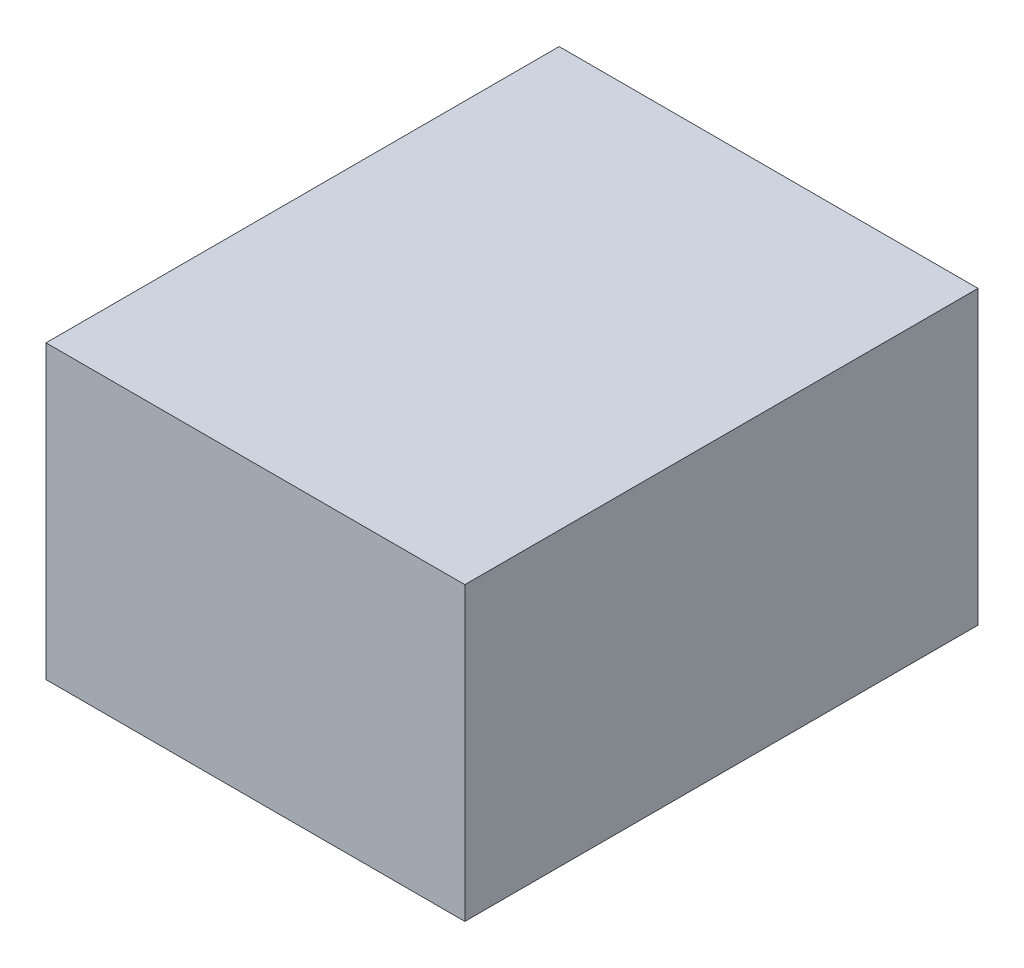
ISO-10303-21;
HEADER;
FILE_DESCRIPTION(('STEP AP214'),'2;1');
FILE_NAME('part.step','',(''),(''),'','','');
FILE_SCHEMA(('AUTOMOTIVE_DESIGN { 1 0 10303 214 1 1 1 1 }'));
ENDSEC;
DATA;
#1=APPLICATION_CONTEXT('core data for automotive mechanical design processes');
#2=APPLICATION_PROTOCOL_DEFINITION('international standard','automotive_design',2000,#1);
#3=PRODUCT_CONTEXT('',#1,'mechanical');
#4=PRODUCT('Part','Part','',(#3));
#5=PRODUCT_RELATED_PRODUCT_CATEGORY('part','',(#4));
#6=PRODUCT_DEFINITION_FORMATION('','',#4);
#7=PRODUCT_DEFINITION_CONTEXT('part definition',#1,'design');
#8=PRODUCT_DEFINITION('design','',#6,#7);
#9=PRODUCT_DEFINITION_SHAPE('','',#8);
#10=(LENGTH_UNIT() NAMED_UNIT(*) SI_UNIT(.MILLI.,.METRE.));
#11=(NAMED_UNIT(*) PLANE_ANGLE_UNIT() SI_UNIT($,.RADIAN.));
#12=(NAMED_UNIT(*) SI_UNIT($,.STERADIAN.) SOLID_ANGLE_UNIT());
#13=UNCERTAINTY_MEASURE_WITH_UNIT(LENGTH_MEASURE(1.E-05),#10,'distance_accuracy_value','');
#14=(GEOMETRIC_REPRESENTATION_CONTEXT(3) GLOBAL_UNCERTAINTY_ASSIGNED_CONTEXT((#13)) GLOBAL_UNIT_ASSIGNED_CONTEXT((#10,
#11,#12)) REPRESENTATION_CONTEXT('',''));
#15=CARTESIAN_POINT('',(0.,0.,0.));
#16=DIRECTION('',(0.,0.,1.));
#17=DIRECTION('',(1.,0.,0.));
#18=AXIS2_PLACEMENT_3D('',#15,#16,#17);
#19=CARTESIAN_POINT('',(-9.55,13.3,-11.7));
#20=DIRECTION('',(1.,0.,0.));
#21=DIRECTION('',(0.,0.,-1.));
#22=AXIS2_PLACEMENT_3D('',#19,#20,#21);
#23=PLANE('',#22);
#24=DIRECTION('',(0.,0.,1.));
#25=VECTOR('',#24,1.);
#26=CARTESIAN_POINT('',(-9.55,0.,-11.7));
#27=LINE('',#26,#25);
#28=CARTESIAN_POINT('',(-9.55,0.,-11.7));
#29=VERTEX_POINT('',#28);
#30=CARTESIAN_POINT('',(-9.55,0.,11.7));
#31=VERTEX_POINT('',#30);
#32=EDGE_CURVE('E111',#29,#31,#27,.T.);
#33=ORIENTED_EDGE('',*,*,#32,.T.);
#34=DIRECTION('',(0.,-1.,0.));
#35=VECTOR('',#34,1.);
#36=CARTESIAN_POINT('',(-9.55,13.3,11.7));
#37=LINE('',#36,#35);
#38=CARTESIAN_POINT('',(-9.55,13.3,11.7));
#39=VERTEX_POINT('',#38);
#40=EDGE_CURVE('E11',#39,#31,#37,.T.);
#41=ORIENTED_EDGE('',*,*,#40,.F.);
#42=DIRECTION('',(0.,0.,1.));
#43=VECTOR('',#42,1.);
#44=CARTESIAN_POINT('',(-9.55,13.3,-11.7));
#45=LINE('',#44,#43);
#46=CARTESIAN_POINT('',(-9.55,13.3,-11.7));
#47=VERTEX_POINT('',#46);
#48=EDGE_CURVE('E95',#47,#39,#45,.T.);
#49=ORIENTED_EDGE('',*,*,#48,.F.);
#50=DIRECTION('',(0.,-1.,0.));
#51=VECTOR('',#50,1.);
#52=CARTESIAN_POINT('',(-9.55,13.3,-11.7));
#53=LINE('',#52,#51);
#54=EDGE_CURVE('E107',#47,#29,#53,.T.);
#55=ORIENTED_EDGE('',*,*,#54,.T.);
#56=EDGE_LOOP('',(#33,#41,#49,#55));
#57=FACE_BOUND('',#56,.T.);
#58=ADVANCED_FACE('F43',(#57),#23,.F.);
#59=CARTESIAN_POINT('',(-9.55,13.3,11.7));
#60=DIRECTION('',(0.,0.,-1.));
#61=DIRECTION('',(-1.,0.,0.));
#62=AXIS2_PLACEMENT_3D('',#59,#60,#61);
#63=PLANE('',#62);
#64=DIRECTION('',(1.,0.,0.));
#65=VECTOR('',#64,1.);
#66=CARTESIAN_POINT('',(-9.55,0.,11.7));
#67=LINE('',#66,#65);
#68=CARTESIAN_POINT('',(9.55,0.,11.7));
#69=VERTEX_POINT('',#68);
#70=EDGE_CURVE('E100',#31,#69,#67,.T.);
#71=ORIENTED_EDGE('',*,*,#70,.T.);
#72=DIRECTION('',(0.,-1.,0.));
#73=VECTOR('',#72,1.);
#74=CARTESIAN_POINT('',(9.55,13.3,11.7));
#75=LINE('',#74,#73);
#76=CARTESIAN_POINT('',(9.55,13.3,11.7));
#77=VERTEX_POINT('',#76);
#78=EDGE_CURVE('E52',#77,#69,#75,.T.);
#79=ORIENTED_EDGE('',*,*,#78,.F.);
#80=DIRECTION('',(1.,0.,0.));
#81=VECTOR('',#80,1.);
#82=CARTESIAN_POINT('',(-9.55,13.3,11.7));
#83=LINE('',#82,#81);
#84=EDGE_CURVE('E90',#39,#77,#83,.T.);
#85=ORIENTED_EDGE('',*,*,#84,.F.);
#86=ORIENTED_EDGE('',*,*,#40,.T.);
#87=EDGE_LOOP('',(#71,#79,#85,#86));
#88=FACE_BOUND('',#87,.T.);
#89=ADVANCED_FACE('F99',(#88),#63,.F.);
#90=CARTESIAN_POINT('',(9.55,13.3,-11.7));
#91=DIRECTION('',(-1.,0.,0.));
#92=DIRECTION('',(0.,0.,1.));
#93=AXIS2_PLACEMENT_3D('',#90,#91,#92);
#94=PLANE('',#93);
#95=DIRECTION('',(0.,0.,-1.));
#96=VECTOR('',#95,1.);
#97=CARTESIAN_POINT('',(9.55,0.,-11.7));
#98=LINE('',#97,#96);
#99=CARTESIAN_POINT('',(9.55,0.,-11.7));
#100=VERTEX_POINT('',#99);
#101=EDGE_CURVE('E77',#69,#100,#98,.T.);
#102=ORIENTED_EDGE('',*,*,#101,.T.);
#103=DIRECTION('',(0.,-1.,0.));
#104=VECTOR('',#103,1.);
#105=CARTESIAN_POINT('',(9.55,13.3,-11.7));
#106=LINE('',#105,#104);
#107=CARTESIAN_POINT('',(9.55,13.3,-11.7));
#108=VERTEX_POINT('',#107);
#109=EDGE_CURVE('E102',#108,#100,#106,.T.);
#110=ORIENTED_EDGE('',*,*,#109,.F.);
#111=DIRECTION('',(0.,0.,-1.));
#112=VECTOR('',#111,1.);
#113=CARTESIAN_POINT('',(9.55,13.3,-11.7));
#114=LINE('',#113,#112);
#115=EDGE_CURVE('E93',#77,#108,#114,.T.);
#116=ORIENTED_EDGE('',*,*,#115,.F.);
#117=ORIENTED_EDGE('',*,*,#78,.T.);
#118=EDGE_LOOP('',(#102,#110,#116,#117));
#119=FACE_BOUND('',#118,.T.);
#120=ADVANCED_FACE('F103',(#119),#94,.F.);
#121=CARTESIAN_POINT('',(-9.55,13.3,-11.7));
#122=DIRECTION('',(0.,0.,1.));
#123=DIRECTION('',(1.,0.,0.));
#124=AXIS2_PLACEMENT_3D('',#121,#122,#123);
#125=PLANE('',#124);
#126=DIRECTION('',(-1.,0.,0.));
#127=VECTOR('',#126,1.);
#128=CARTESIAN_POINT('',(-9.55,0.,-11.7));
#129=LINE('',#128,#127);
#130=EDGE_CURVE('E83',#100,#29,#129,.T.);
#131=ORIENTED_EDGE('',*,*,#130,.T.);
#132=ORIENTED_EDGE('',*,*,#54,.F.);
#133=DIRECTION('',(-1.,0.,0.));
#134=VECTOR('',#133,1.);
#135=CARTESIAN_POINT('',(-9.55,13.3,-11.7));
#136=LINE('',#135,#134);
#137=EDGE_CURVE('E60',#108,#47,#136,.T.);
#138=ORIENTED_EDGE('',*,*,#137,.F.);
#139=ORIENTED_EDGE('',*,*,#109,.T.);
#140=EDGE_LOOP('',(#131,#132,#138,#139));
#141=FACE_BOUND('',#140,.T.);
#142=ADVANCED_FACE('F124',(#141),#125,.F.);
#143=CARTESIAN_POINT('',(0.,13.3,0.));
#144=DIRECTION('',(0.,1.,0.));
#145=DIRECTION('',(0.,0.,1.));
#146=AXIS2_PLACEMENT_3D('',#143,#144,#145);
#147=PLANE('',#146);
#148=ORIENTED_EDGE('',*,*,#48,.T.);
#149=ORIENTED_EDGE('',*,*,#84,.T.);
#150=ORIENTED_EDGE('',*,*,#115,.T.);
#151=ORIENTED_EDGE('',*,*,#137,.T.);
#152=EDGE_LOOP('',(#148,#149,#150,#151));
#153=FACE_BOUND('',#152,.T.);
#154=ADVANCED_FACE('F91',(#153),#147,.T.);
#155=CARTESIAN_POINT('',(0.,0.,0.));
#156=DIRECTION('',(0.,1.,0.));
#157=DIRECTION('',(0.,0.,1.));
#158=AXIS2_PLACEMENT_3D('',#155,#156,#157);
#159=PLANE('',#158);
#160=ORIENTED_EDGE('',*,*,#32,.F.);
#161=ORIENTED_EDGE('',*,*,#130,.F.);
#162=ORIENTED_EDGE('',*,*,#101,.F.);
#163=ORIENTED_EDGE('',*,*,#70,.F.);
#164=EDGE_LOOP('',(#160,#161,#162,#163));
#165=FACE_BOUND('',#164,.T.);
#166=ADVANCED_FACE('F127',(#165),#159,.F.);
#167=CLOSED_SHELL('',(#58,#89,#120,#142,#154,#166));
#168=MANIFOLD_SOLID_BREP('B2',#167);
#169=ADVANCED_BREP_SHAPE_REPRESENTATION('',(#18,#168),#14);
#170=SHAPE_DEFINITION_REPRESENTATION(#9,#169);
ENDSEC;
END-ISO-10303-21;
